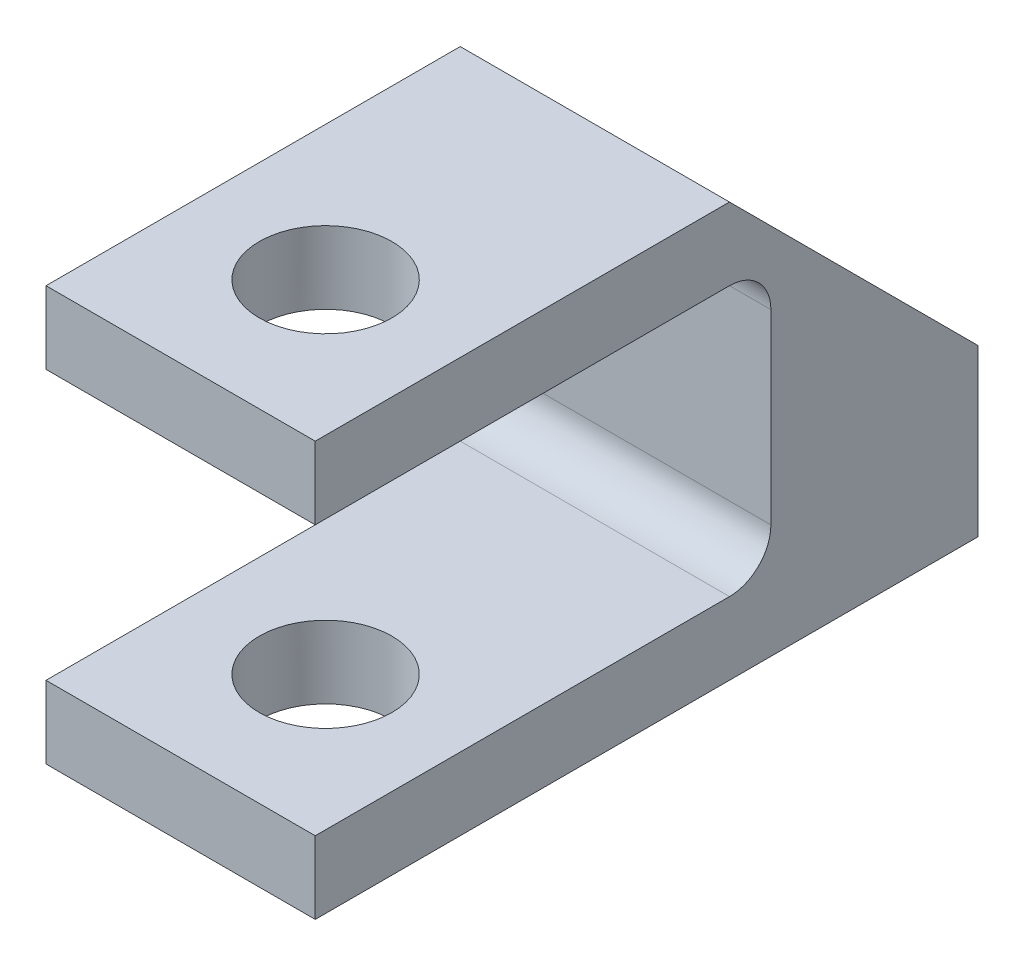
ISO-10303-21;
HEADER;
FILE_DESCRIPTION(('STEP AP214'),'2;1');
FILE_NAME('part.step','',(''),(''),'','','');
FILE_SCHEMA(('AUTOMOTIVE_DESIGN { 1 0 10303 214 1 1 1 1 }'));
ENDSEC;
DATA;
#1=APPLICATION_CONTEXT('core data for automotive mechanical design processes');
#2=APPLICATION_PROTOCOL_DEFINITION('international standard','automotive_design',2000,#1);
#3=PRODUCT_CONTEXT('',#1,'mechanical');
#4=PRODUCT('Part','Part','',(#3));
#5=PRODUCT_RELATED_PRODUCT_CATEGORY('part','',(#4));
#6=PRODUCT_DEFINITION_FORMATION('','',#4);
#7=PRODUCT_DEFINITION_CONTEXT('part definition',#1,'design');
#8=PRODUCT_DEFINITION('design','',#6,#7);
#9=PRODUCT_DEFINITION_SHAPE('','',#8);
#10=(LENGTH_UNIT() NAMED_UNIT(*) SI_UNIT(.MILLI.,.METRE.));
#11=(NAMED_UNIT(*) PLANE_ANGLE_UNIT() SI_UNIT($,.RADIAN.));
#12=(NAMED_UNIT(*) SI_UNIT($,.STERADIAN.) SOLID_ANGLE_UNIT());
#13=UNCERTAINTY_MEASURE_WITH_UNIT(LENGTH_MEASURE(1.E-05),#10,'distance_accuracy_value','');
#14=(GEOMETRIC_REPRESENTATION_CONTEXT(3) GLOBAL_UNCERTAINTY_ASSIGNED_CONTEXT((#13)) GLOBAL_UNIT_ASSIGNED_CONTEXT((#10,
#11,#12)) REPRESENTATION_CONTEXT('',''));
#15=CARTESIAN_POINT('',(0.,0.,0.));
#16=DIRECTION('',(0.,0.,1.));
#17=DIRECTION('',(1.,0.,0.));
#18=AXIS2_PLACEMENT_3D('',#15,#16,#17);
#19=CARTESIAN_POINT('',(-6.5,-5.,8.));
#20=DIRECTION('',(0.,0.,1.));
#21=DIRECTION('',(1.,0.,0.));
#22=AXIS2_PLACEMENT_3D('',#19,#20,#21);
#23=PLANE('',#22);
#24=DIRECTION('',(0.,-1.,0.));
#25=VECTOR('',#24,1.);
#26=CARTESIAN_POINT('',(-6.5,-5.,8.));
#27=LINE('',#26,#25);
#28=CARTESIAN_POINT('',(-6.5,5.,8.));
#29=VERTEX_POINT('',#28);
#30=CARTESIAN_POINT('',(-6.5,3.25,8.));
#31=VERTEX_POINT('',#30);
#32=EDGE_CURVE('E125',#29,#31,#27,.T.);
#33=ORIENTED_EDGE('',*,*,#32,.T.);
#34=DIRECTION('',(1.,0.,0.));
#35=VECTOR('',#34,1.);
#36=CARTESIAN_POINT('',(-10.25,3.25,8.));
#37=LINE('',#36,#35);
#38=CARTESIAN_POINT('',(0.,3.25,8.));
#39=VERTEX_POINT('',#38);
#40=EDGE_CURVE('E131',#31,#39,#37,.T.);
#41=ORIENTED_EDGE('',*,*,#40,.T.);
#42=DIRECTION('',(0.,-1.,0.));
#43=VECTOR('',#42,1.);
#44=CARTESIAN_POINT('',(0.,-5.,8.));
#45=LINE('',#44,#43);
#46=CARTESIAN_POINT('',(0.,5.,8.));
#47=VERTEX_POINT('',#46);
#48=EDGE_CURVE('E160',#47,#39,#45,.T.);
#49=ORIENTED_EDGE('',*,*,#48,.F.);
#50=DIRECTION('',(1.,0.,0.));
#51=VECTOR('',#50,1.);
#52=CARTESIAN_POINT('',(-6.5,5.,8.));
#53=LINE('',#52,#51);
#54=EDGE_CURVE('E143',#29,#47,#53,.T.);
#55=ORIENTED_EDGE('',*,*,#54,.F.);
#56=EDGE_LOOP('',(#33,#41,#49,#55));
#57=FACE_BOUND('',#56,.T.);
#58=ADVANCED_FACE('F39',(#57),#23,.T.);
#59=CARTESIAN_POINT('',(-6.5,0.,0.));
#60=DIRECTION('',(-1.,0.,0.));
#61=DIRECTION('',(0.,0.,1.));
#62=AXIS2_PLACEMENT_3D('',#59,#60,#61);
#63=PLANE('',#62);
#64=DIRECTION('',(0.,0.,1.));
#65=VECTOR('',#64,1.);
#66=CARTESIAN_POINT('',(-6.5,-3.25,0.));
#67=LINE('',#66,#65);
#68=CARTESIAN_POINT('',(-6.5,-3.25,-2.));
#69=VERTEX_POINT('',#68);
#70=CARTESIAN_POINT('',(-6.5,-3.25,8.));
#71=VERTEX_POINT('',#70);
#72=EDGE_CURVE('E128',#69,#71,#67,.T.);
#73=ORIENTED_EDGE('',*,*,#72,.F.);
#74=CARTESIAN_POINT('',(-6.5,-2.25,-2.));
#75=DIRECTION('',(-1.,0.,0.));
#76=DIRECTION('',(0.,0.,1.));
#77=AXIS2_PLACEMENT_3D('',#74,#75,#76);
#78=CIRCLE('',#77,1.);
#79=CARTESIAN_POINT('',(-6.5,-2.25,-3.));
#80=VERTEX_POINT('',#79);
#81=EDGE_CURVE('E193',#69,#80,#78,.F.);
#82=ORIENTED_EDGE('',*,*,#81,.T.);
#83=DIRECTION('',(0.,1.,0.));
#84=VECTOR('',#83,1.);
#85=CARTESIAN_POINT('',(-6.5,0.,-3.));
#86=LINE('',#85,#84);
#87=CARTESIAN_POINT('',(-6.5,2.25,-3.));
#88=VERTEX_POINT('',#87);
#89=EDGE_CURVE('E237',#80,#88,#86,.T.);
#90=ORIENTED_EDGE('',*,*,#89,.T.);
#91=CARTESIAN_POINT('',(-6.5,2.25,-2.));
#92=DIRECTION('',(-1.,0.,0.));
#93=DIRECTION('',(0.,0.,1.));
#94=AXIS2_PLACEMENT_3D('',#91,#92,#93);
#95=CIRCLE('',#94,1.);
#96=CARTESIAN_POINT('',(-6.5,3.25,-2.));
#97=VERTEX_POINT('',#96);
#98=EDGE_CURVE('E11',#88,#97,#95,.F.);
#99=ORIENTED_EDGE('',*,*,#98,.T.);
#100=DIRECTION('',(0.,0.,1.));
#101=VECTOR('',#100,1.);
#102=CARTESIAN_POINT('',(-6.5,3.25,0.));
#103=LINE('',#102,#101);
#104=EDGE_CURVE('E119',#97,#31,#103,.T.);
#105=ORIENTED_EDGE('',*,*,#104,.T.);
#106=ORIENTED_EDGE('',*,*,#32,.F.);
#107=DIRECTION('',(0.,0.,1.));
#108=VECTOR('',#107,1.);
#109=CARTESIAN_POINT('',(-6.5,5.,8.));
#110=LINE('',#109,#108);
#111=CARTESIAN_POINT('',(-6.5,5.,-2.));
#112=VERTEX_POINT('',#111);
#113=EDGE_CURVE('E149',#112,#29,#110,.T.);
#114=ORIENTED_EDGE('',*,*,#113,.F.);
#115=DIRECTION('',(0.,-0.707106781186548,-0.707106781186548));
#116=VECTOR('',#115,1.);
#117=CARTESIAN_POINT('',(-6.5,-1.,-8.));
#118=LINE('',#117,#116);
#119=CARTESIAN_POINT('',(-6.5,-1.,-8.));
#120=VERTEX_POINT('',#119);
#121=EDGE_CURVE('E253',#112,#120,#118,.T.);
#122=ORIENTED_EDGE('',*,*,#121,.T.);
#123=DIRECTION('',(0.,1.,0.));
#124=VECTOR('',#123,1.);
#125=CARTESIAN_POINT('',(-6.5,-5.,-8.));
#126=LINE('',#125,#124);
#127=CARTESIAN_POINT('',(-6.5,-5.,-8.));
#128=VERTEX_POINT('',#127);
#129=EDGE_CURVE('E165',#128,#120,#126,.T.);
#130=ORIENTED_EDGE('',*,*,#129,.F.);
#131=DIRECTION('',(0.,0.,-1.));
#132=VECTOR('',#131,1.);
#133=CARTESIAN_POINT('',(-6.5,-5.,8.));
#134=LINE('',#133,#132);
#135=CARTESIAN_POINT('',(-6.5,-5.,8.));
#136=VERTEX_POINT('',#135);
#137=EDGE_CURVE('E144',#136,#128,#134,.T.);
#138=ORIENTED_EDGE('',*,*,#137,.F.);
#139=EDGE_CURVE('E145',#71,#136,#27,.T.);
#140=ORIENTED_EDGE('',*,*,#139,.F.);
#141=EDGE_LOOP('',(#73,#82,#90,#99,#105,#106,#114,#122,#130,#138,#140));
#142=FACE_BOUND('',#141,.T.);
#143=ADVANCED_FACE('F122',(#142),#63,.T.);
#144=CARTESIAN_POINT('',(0.,0.,0.));
#145=DIRECTION('',(-1.,0.,0.));
#146=DIRECTION('',(0.,0.,1.));
#147=AXIS2_PLACEMENT_3D('',#144,#145,#146);
#148=PLANE('',#147);
#149=DIRECTION('',(0.,0.,1.));
#150=VECTOR('',#149,1.);
#151=CARTESIAN_POINT('',(0.,3.25,0.));
#152=LINE('',#151,#150);
#153=CARTESIAN_POINT('',(0.,3.25,-2.));
#154=VERTEX_POINT('',#153);
#155=EDGE_CURVE('E134',#154,#39,#152,.T.);
#156=ORIENTED_EDGE('',*,*,#155,.F.);
#157=CARTESIAN_POINT('',(0.,2.25,-2.));
#158=DIRECTION('',(-1.,0.,0.));
#159=DIRECTION('',(0.,0.,1.));
#160=AXIS2_PLACEMENT_3D('',#157,#158,#159);
#161=CIRCLE('',#160,1.);
#162=CARTESIAN_POINT('',(0.,2.25,-3.));
#163=VERTEX_POINT('',#162);
#164=EDGE_CURVE('E47',#154,#163,#161,.T.);
#165=ORIENTED_EDGE('',*,*,#164,.T.);
#166=DIRECTION('',(0.,1.,0.));
#167=VECTOR('',#166,1.);
#168=CARTESIAN_POINT('',(0.,0.,-3.));
#169=LINE('',#168,#167);
#170=CARTESIAN_POINT('',(0.,-2.25,-3.));
#171=VERTEX_POINT('',#170);
#172=EDGE_CURVE('E168',#171,#163,#169,.T.);
#173=ORIENTED_EDGE('',*,*,#172,.F.);
#174=CARTESIAN_POINT('',(0.,-2.25,-2.));
#175=DIRECTION('',(-1.,0.,0.));
#176=DIRECTION('',(0.,0.,1.));
#177=AXIS2_PLACEMENT_3D('',#174,#175,#176);
#178=CIRCLE('',#177,1.);
#179=CARTESIAN_POINT('',(0.,-3.25,-2.));
#180=VERTEX_POINT('',#179);
#181=EDGE_CURVE('E191',#171,#180,#178,.T.);
#182=ORIENTED_EDGE('',*,*,#181,.T.);
#183=DIRECTION('',(0.,0.,1.));
#184=VECTOR('',#183,1.);
#185=CARTESIAN_POINT('',(0.,-3.25,0.));
#186=LINE('',#185,#184);
#187=CARTESIAN_POINT('',(0.,-3.25,8.));
#188=VERTEX_POINT('',#187);
#189=EDGE_CURVE('E175',#180,#188,#186,.T.);
#190=ORIENTED_EDGE('',*,*,#189,.T.);
#191=CARTESIAN_POINT('',(0.,-5.,8.));
#192=VERTEX_POINT('',#191);
#193=EDGE_CURVE('E159',#188,#192,#45,.T.);
#194=ORIENTED_EDGE('',*,*,#193,.T.);
#195=DIRECTION('',(0.,0.,-1.));
#196=VECTOR('',#195,1.);
#197=CARTESIAN_POINT('',(0.,-5.,8.));
#198=LINE('',#197,#196);
#199=CARTESIAN_POINT('',(0.,-5.,-8.));
#200=VERTEX_POINT('',#199);
#201=EDGE_CURVE('E162',#192,#200,#198,.T.);
#202=ORIENTED_EDGE('',*,*,#201,.T.);
#203=DIRECTION('',(0.,1.,0.));
#204=VECTOR('',#203,1.);
#205=CARTESIAN_POINT('',(0.,-5.,-8.));
#206=LINE('',#205,#204);
#207=CARTESIAN_POINT('',(0.,-1.,-8.));
#208=VERTEX_POINT('',#207);
#209=EDGE_CURVE('E153',#200,#208,#206,.T.);
#210=ORIENTED_EDGE('',*,*,#209,.T.);
#211=DIRECTION('',(0.,-0.707106781186548,-0.707106781186548));
#212=VECTOR('',#211,1.);
#213=CARTESIAN_POINT('',(0.,-1.,-8.));
#214=LINE('',#213,#212);
#215=CARTESIAN_POINT('',(0.,5.,-2.));
#216=VERTEX_POINT('',#215);
#217=EDGE_CURVE('E127',#216,#208,#214,.T.);
#218=ORIENTED_EDGE('',*,*,#217,.F.);
#219=DIRECTION('',(0.,0.,1.));
#220=VECTOR('',#219,1.);
#221=CARTESIAN_POINT('',(0.,5.,8.));
#222=LINE('',#221,#220);
#223=EDGE_CURVE('E156',#216,#47,#222,.T.);
#224=ORIENTED_EDGE('',*,*,#223,.T.);
#225=ORIENTED_EDGE('',*,*,#48,.T.);
#226=EDGE_LOOP('',(#156,#165,#173,#182,#190,#194,#202,#210,#218,#224,#225));
#227=FACE_BOUND('',#226,.T.);
#228=ADVANCED_FACE('F196',(#227),#148,.F.);
#229=CARTESIAN_POINT('',(-6.5,-5.,-8.));
#230=DIRECTION('',(0.,0.,-1.));
#231=DIRECTION('',(-1.,0.,0.));
#232=AXIS2_PLACEMENT_3D('',#229,#230,#231);
#233=PLANE('',#232);
#234=DIRECTION('',(1.,0.,0.));
#235=VECTOR('',#234,1.);
#236=CARTESIAN_POINT('',(-6.5,-1.,-8.));
#237=LINE('',#236,#235);
#238=EDGE_CURVE('E157',#120,#208,#237,.T.);
#239=ORIENTED_EDGE('',*,*,#238,.T.);
#240=ORIENTED_EDGE('',*,*,#209,.F.);
#241=DIRECTION('',(1.,0.,0.));
#242=VECTOR('',#241,1.);
#243=CARTESIAN_POINT('',(-6.5,-5.,-8.));
#244=LINE('',#243,#242);
#245=EDGE_CURVE('E166',#128,#200,#244,.T.);
#246=ORIENTED_EDGE('',*,*,#245,.F.);
#247=ORIENTED_EDGE('',*,*,#129,.T.);
#248=EDGE_LOOP('',(#239,#240,#246,#247));
#249=FACE_BOUND('',#248,.T.);
#250=ADVANCED_FACE('F228',(#249),#233,.T.);
#251=CARTESIAN_POINT('',(-6.5,-5.,8.));
#252=DIRECTION('',(0.,-1.,0.));
#253=DIRECTION('',(0.,0.,-1.));
#254=AXIS2_PLACEMENT_3D('',#251,#252,#253);
#255=PLANE('',#254);
#256=CARTESIAN_POINT('',(-3.25,-5.,4.5));
#257=DIRECTION('',(0.,1.,0.));
#258=DIRECTION('',(0.,0.,1.));
#259=AXIS2_PLACEMENT_3D('',#256,#257,#258);
#260=CIRCLE('',#259,1.6);
#261=CARTESIAN_POINT('',(-3.25,-5.,6.1));
#262=VERTEX_POINT('',#261);
#263=EDGE_CURVE('E182',#262,#262,#260,.T.);
#264=ORIENTED_EDGE('',*,*,#263,.T.);
#265=EDGE_LOOP('',(#264));
#266=FACE_BOUND('',#265,.T.);
#267=ORIENTED_EDGE('',*,*,#201,.F.);
#268=DIRECTION('',(1.,0.,0.));
#269=VECTOR('',#268,1.);
#270=CARTESIAN_POINT('',(-6.5,-5.,8.));
#271=LINE('',#270,#269);
#272=EDGE_CURVE('E169',#136,#192,#271,.T.);
#273=ORIENTED_EDGE('',*,*,#272,.F.);
#274=ORIENTED_EDGE('',*,*,#137,.T.);
#275=ORIENTED_EDGE('',*,*,#245,.T.);
#276=EDGE_LOOP('',(#267,#273,#274,#275));
#277=FACE_BOUND('',#276,.T.);
#278=ADVANCED_FACE('F220',(#266,#277),#255,.T.);
#279=DIRECTION('',(1.,0.,0.));
#280=VECTOR('',#279,1.);
#281=CARTESIAN_POINT('',(-10.25,-3.25,8.));
#282=LINE('',#281,#280);
#283=EDGE_CURVE('E138',#71,#188,#282,.T.);
#284=ORIENTED_EDGE('',*,*,#283,.F.);
#285=ORIENTED_EDGE('',*,*,#139,.T.);
#286=ORIENTED_EDGE('',*,*,#272,.T.);
#287=ORIENTED_EDGE('',*,*,#193,.F.);
#288=EDGE_LOOP('',(#284,#285,#286,#287));
#289=FACE_BOUND('',#288,.T.);
#290=ADVANCED_FACE('F210',(#289),#23,.T.);
#291=CARTESIAN_POINT('',(-6.5,5.,8.));
#292=DIRECTION('',(0.,1.,0.));
#293=DIRECTION('',(0.,0.,1.));
#294=AXIS2_PLACEMENT_3D('',#291,#292,#293);
#295=PLANE('',#294);
#296=CARTESIAN_POINT('',(-3.25,5.,4.5));
#297=DIRECTION('',(0.,1.,0.));
#298=DIRECTION('',(0.,0.,1.));
#299=AXIS2_PLACEMENT_3D('',#296,#297,#298);
#300=CIRCLE('',#299,1.6);
#301=CARTESIAN_POINT('',(-3.25,5.,6.1));
#302=VERTEX_POINT('',#301);
#303=EDGE_CURVE('E294',#302,#302,#300,.T.);
#304=ORIENTED_EDGE('',*,*,#303,.F.);
#305=EDGE_LOOP('',(#304));
#306=FACE_BOUND('',#305,.T.);
#307=DIRECTION('',(1.,0.,0.));
#308=VECTOR('',#307,1.);
#309=CARTESIAN_POINT('',(-6.5,5.,-2.));
#310=LINE('',#309,#308);
#311=EDGE_CURVE('E255',#112,#216,#310,.T.);
#312=ORIENTED_EDGE('',*,*,#311,.F.);
#313=ORIENTED_EDGE('',*,*,#113,.T.);
#314=ORIENTED_EDGE('',*,*,#54,.T.);
#315=ORIENTED_EDGE('',*,*,#223,.F.);
#316=EDGE_LOOP('',(#312,#313,#314,#315));
#317=FACE_BOUND('',#316,.T.);
#318=ADVANCED_FACE('F219',(#306,#317),#295,.T.);
#319=CARTESIAN_POINT('',(-6.5,-1.,-8.));
#320=DIRECTION('',(0.,-0.707106781186548,0.707106781186548));
#321=DIRECTION('',(0.,-0.707106781186548,-0.707106781186548));
#322=AXIS2_PLACEMENT_3D('',#319,#320,#321);
#323=PLANE('',#322);
#324=ORIENTED_EDGE('',*,*,#217,.T.);
#325=ORIENTED_EDGE('',*,*,#238,.F.);
#326=ORIENTED_EDGE('',*,*,#121,.F.);
#327=ORIENTED_EDGE('',*,*,#311,.T.);
#328=EDGE_LOOP('',(#324,#325,#326,#327));
#329=FACE_BOUND('',#328,.T.);
#330=ADVANCED_FACE('F226',(#329),#323,.F.);
#331=CARTESIAN_POINT('',(-10.25,3.25,-3.));
#332=DIRECTION('',(0.,-1.,0.));
#333=DIRECTION('',(0.,0.,-1.));
#334=AXIS2_PLACEMENT_3D('',#331,#332,#333);
#335=PLANE('',#334);
#336=CARTESIAN_POINT('',(-3.25,3.25,4.5));
#337=DIRECTION('',(0.,-1.,0.));
#338=DIRECTION('',(0.,0.,-1.));
#339=AXIS2_PLACEMENT_3D('',#336,#337,#338);
#340=CIRCLE('',#339,1.6);
#341=CARTESIAN_POINT('',(-3.25,3.25,2.9));
#342=VERTEX_POINT('',#341);
#343=EDGE_CURVE('E139',#342,#342,#340,.T.);
#344=ORIENTED_EDGE('',*,*,#343,.F.);
#345=EDGE_LOOP('',(#344));
#346=FACE_BOUND('',#345,.T.);
#347=ORIENTED_EDGE('',*,*,#104,.F.);
#348=DIRECTION('',(1.,0.,0.));
#349=VECTOR('',#348,1.);
#350=CARTESIAN_POINT('',(0.,3.25,-2.));
#351=LINE('',#350,#349);
#352=EDGE_CURVE('E189',#97,#154,#351,.T.);
#353=ORIENTED_EDGE('',*,*,#352,.T.);
#354=ORIENTED_EDGE('',*,*,#155,.T.);
#355=ORIENTED_EDGE('',*,*,#40,.F.);
#356=EDGE_LOOP('',(#347,#353,#354,#355));
#357=FACE_BOUND('',#356,.T.);
#358=ADVANCED_FACE('F132',(#346,#357),#335,.T.);
#359=CARTESIAN_POINT('',(-10.25,-3.25,-3.));
#360=DIRECTION('',(0.,-1.,0.));
#361=DIRECTION('',(0.,0.,-1.));
#362=AXIS2_PLACEMENT_3D('',#359,#360,#361);
#363=PLANE('',#362);
#364=CARTESIAN_POINT('',(-3.25,-3.25,4.5));
#365=DIRECTION('',(0.,-1.,0.));
#366=DIRECTION('',(0.,0.,-1.));
#367=AXIS2_PLACEMENT_3D('',#364,#365,#366);
#368=CIRCLE('',#367,1.6);
#369=CARTESIAN_POINT('',(-3.25,-3.25,2.9));
#370=VERTEX_POINT('',#369);
#371=EDGE_CURVE('E179',#370,#370,#368,.T.);
#372=ORIENTED_EDGE('',*,*,#371,.T.);
#373=EDGE_LOOP('',(#372));
#374=FACE_BOUND('',#373,.T.);
#375=ORIENTED_EDGE('',*,*,#189,.F.);
#376=DIRECTION('',(1.,0.,0.));
#377=VECTOR('',#376,1.);
#378=CARTESIAN_POINT('',(-10.25,-3.25,-2.));
#379=LINE('',#378,#377);
#380=EDGE_CURVE('E187',#180,#69,#379,.F.);
#381=ORIENTED_EDGE('',*,*,#380,.T.);
#382=ORIENTED_EDGE('',*,*,#72,.T.);
#383=ORIENTED_EDGE('',*,*,#283,.T.);
#384=EDGE_LOOP('',(#375,#381,#382,#383));
#385=FACE_BOUND('',#384,.T.);
#386=ADVANCED_FACE('F249',(#374,#385),#363,.F.);
#387=CARTESIAN_POINT('',(0.,0.,-3.));
#388=DIRECTION('',(0.,0.,1.));
#389=DIRECTION('',(1.,0.,0.));
#390=AXIS2_PLACEMENT_3D('',#387,#388,#389);
#391=PLANE('',#390);
#392=ORIENTED_EDGE('',*,*,#89,.F.);
#393=DIRECTION('',(1.,0.,0.));
#394=VECTOR('',#393,1.);
#395=CARTESIAN_POINT('',(0.,-2.25,-3.));
#396=LINE('',#395,#394);
#397=EDGE_CURVE('E184',#80,#171,#396,.T.);
#398=ORIENTED_EDGE('',*,*,#397,.T.);
#399=ORIENTED_EDGE('',*,*,#172,.T.);
#400=DIRECTION('',(1.,0.,0.));
#401=VECTOR('',#400,1.);
#402=CARTESIAN_POINT('',(-6.5,2.25,-3.));
#403=LINE('',#402,#401);
#404=EDGE_CURVE('E178',#163,#88,#403,.F.);
#405=ORIENTED_EDGE('',*,*,#404,.T.);
#406=EDGE_LOOP('',(#392,#398,#399,#405));
#407=FACE_BOUND('',#406,.T.);
#408=ADVANCED_FACE('F199',(#407),#391,.T.);
#409=CARTESIAN_POINT('',(-3.25,-5.,4.5));
#410=DIRECTION('',(0.,1.,0.));
#411=DIRECTION('',(0.,0.,1.));
#412=AXIS2_PLACEMENT_3D('',#409,#410,#411);
#413=CYLINDRICAL_SURFACE('',#412,1.6);
#414=ORIENTED_EDGE('',*,*,#263,.F.);
#415=EDGE_LOOP('',(#414));
#416=FACE_BOUND('',#415,.T.);
#417=ORIENTED_EDGE('',*,*,#371,.F.);
#418=EDGE_LOOP('',(#417));
#419=FACE_BOUND('',#418,.T.);
#420=ADVANCED_FACE('F282',(#416,#419),#413,.F.);
#421=ORIENTED_EDGE('',*,*,#343,.T.);
#422=EDGE_LOOP('',(#421));
#423=FACE_BOUND('',#422,.T.);
#424=ORIENTED_EDGE('',*,*,#303,.T.);
#425=EDGE_LOOP('',(#424));
#426=FACE_BOUND('',#425,.T.);
#427=ADVANCED_FACE('F206',(#423,#426),#413,.F.);
#428=CARTESIAN_POINT('',(0.,-2.25,-2.));
#429=DIRECTION('',(1.,0.,0.));
#430=DIRECTION('',(0.,0.,-1.));
#431=AXIS2_PLACEMENT_3D('',#428,#429,#430);
#432=CYLINDRICAL_SURFACE('',#431,1.);
#433=ORIENTED_EDGE('',*,*,#81,.F.);
#434=ORIENTED_EDGE('',*,*,#380,.F.);
#435=ORIENTED_EDGE('',*,*,#181,.F.);
#436=ORIENTED_EDGE('',*,*,#397,.F.);
#437=EDGE_LOOP('',(#433,#434,#435,#436));
#438=FACE_BOUND('',#437,.T.);
#439=ADVANCED_FACE('F202',(#438),#432,.F.);
#440=CARTESIAN_POINT('',(-10.25,2.25,-2.));
#441=DIRECTION('',(-1.,0.,0.));
#442=DIRECTION('',(0.,0.,1.));
#443=AXIS2_PLACEMENT_3D('',#440,#441,#442);
#444=CYLINDRICAL_SURFACE('',#443,1.);
#445=ORIENTED_EDGE('',*,*,#98,.F.);
#446=ORIENTED_EDGE('',*,*,#404,.F.);
#447=ORIENTED_EDGE('',*,*,#164,.F.);
#448=ORIENTED_EDGE('',*,*,#352,.F.);
#449=EDGE_LOOP('',(#445,#446,#447,#448));
#450=FACE_BOUND('',#449,.T.);
#451=ADVANCED_FACE('F41',(#450),#444,.F.);
#452=CLOSED_SHELL('',(#58,#143,#228,#250,#278,#290,#318,#330,#358,#386,#408,#420,#427,#439,#451));
#453=MANIFOLD_SOLID_BREP('B2',#452);
#454=ADVANCED_BREP_SHAPE_REPRESENTATION('',(#18,#453),#14);
#455=SHAPE_DEFINITION_REPRESENTATION(#9,#454);
ENDSEC;
END-ISO-10303-21;
